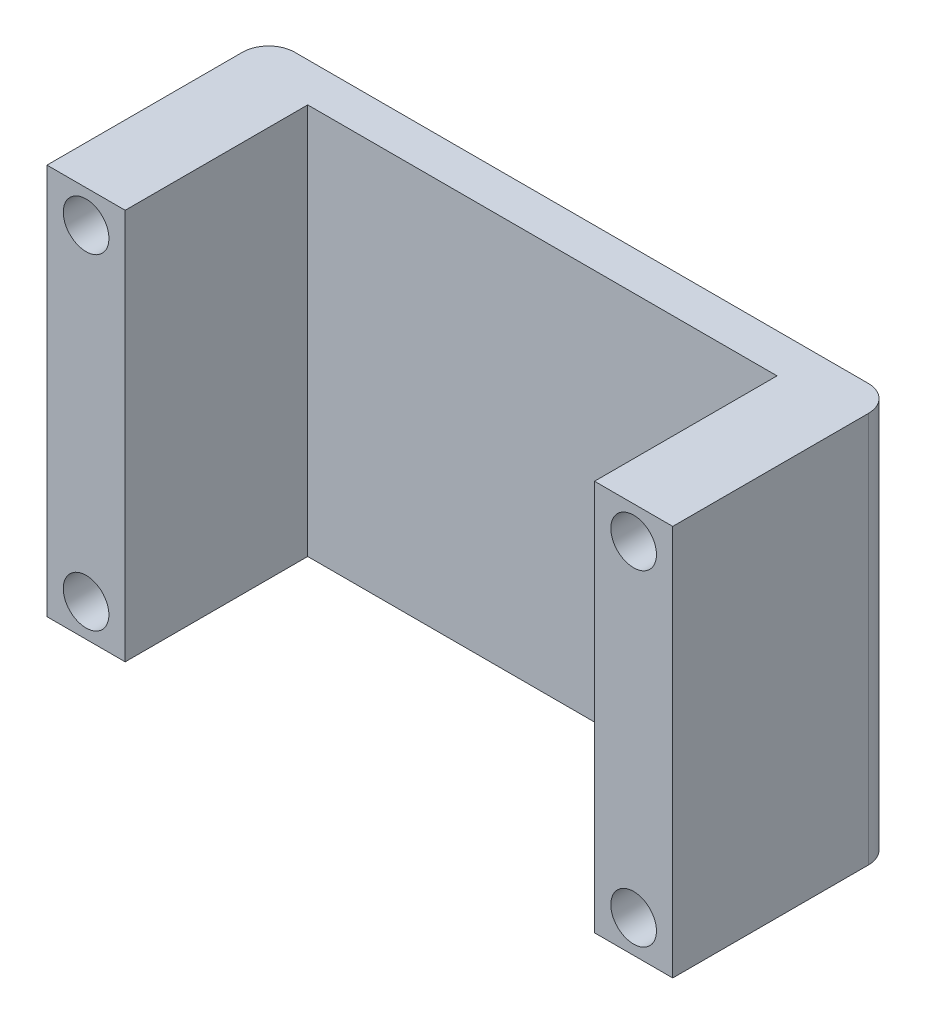
ISO-10303-21;
HEADER;
FILE_DESCRIPTION(('STEP AP214'),'2;1');
FILE_NAME('part.step','',(''),(''),'','','');
FILE_SCHEMA(('AUTOMOTIVE_DESIGN { 1 0 10303 214 1 1 1 1 }'));
ENDSEC;
DATA;
#1=APPLICATION_CONTEXT('core data for automotive mechanical design processes');
#2=APPLICATION_PROTOCOL_DEFINITION('international standard','automotive_design',2000,#1);
#3=PRODUCT_CONTEXT('',#1,'mechanical');
#4=PRODUCT('Part','Part','',(#3));
#5=PRODUCT_RELATED_PRODUCT_CATEGORY('part','',(#4));
#6=PRODUCT_DEFINITION_FORMATION('','',#4);
#7=PRODUCT_DEFINITION_CONTEXT('part definition',#1,'design');
#8=PRODUCT_DEFINITION('design','',#6,#7);
#9=PRODUCT_DEFINITION_SHAPE('','',#8);
#10=(LENGTH_UNIT() NAMED_UNIT(*) SI_UNIT(.MILLI.,.METRE.));
#11=(NAMED_UNIT(*) PLANE_ANGLE_UNIT() SI_UNIT($,.RADIAN.));
#12=(NAMED_UNIT(*) SI_UNIT($,.STERADIAN.) SOLID_ANGLE_UNIT());
#13=UNCERTAINTY_MEASURE_WITH_UNIT(LENGTH_MEASURE(1.E-05),#10,'distance_accuracy_value','');
#14=(GEOMETRIC_REPRESENTATION_CONTEXT(3) GLOBAL_UNCERTAINTY_ASSIGNED_CONTEXT((#13)) GLOBAL_UNIT_ASSIGNED_CONTEXT((#10,
#11,#12)) REPRESENTATION_CONTEXT('',''));
#15=CARTESIAN_POINT('',(0.,0.,0.));
#16=DIRECTION('',(0.,0.,1.));
#17=DIRECTION('',(1.,0.,0.));
#18=AXIS2_PLACEMENT_3D('',#15,#16,#17);
#19=CARTESIAN_POINT('',(0.,0.,3.));
#20=DIRECTION('',(0.,0.,1.));
#21=DIRECTION('',(1.,0.,0.));
#22=AXIS2_PLACEMENT_3D('',#19,#20,#21);
#23=PLANE('',#22);
#24=DIRECTION('',(-1.,0.,0.));
#25=VECTOR('',#24,1.);
#26=CARTESIAN_POINT('',(0.,-2.5,3.));
#27=LINE('',#26,#25);
#28=CARTESIAN_POINT('',(18.,-2.5,3.));
#29=VERTEX_POINT('',#28);
#30=CARTESIAN_POINT('',(-18.,-2.5,3.));
#31=VERTEX_POINT('',#30);
#32=EDGE_CURVE('E218',#29,#31,#27,.T.);
#33=ORIENTED_EDGE('',*,*,#32,.F.);
#34=DIRECTION('',(0.,-1.,0.));
#35=VECTOR('',#34,1.);
#36=CARTESIAN_POINT('',(18.,0.,3.));
#37=LINE('',#36,#35);
#38=CARTESIAN_POINT('',(18.,27.5,3.));
#39=VERTEX_POINT('',#38);
#40=EDGE_CURVE('E363',#39,#29,#37,.T.);
#41=ORIENTED_EDGE('',*,*,#40,.F.);
#42=DIRECTION('',(-1.,0.,0.));
#43=VECTOR('',#42,1.);
#44=CARTESIAN_POINT('',(0.,27.5,3.));
#45=LINE('',#44,#43);
#46=CARTESIAN_POINT('',(-18.,27.5,3.));
#47=VERTEX_POINT('',#46);
#48=EDGE_CURVE('E174',#39,#47,#45,.T.);
#49=ORIENTED_EDGE('',*,*,#48,.T.);
#50=DIRECTION('',(0.,-1.,0.));
#51=VECTOR('',#50,1.);
#52=CARTESIAN_POINT('',(-18.,0.,3.));
#53=LINE('',#52,#51);
#54=EDGE_CURVE('E176',#47,#31,#53,.T.);
#55=ORIENTED_EDGE('',*,*,#54,.T.);
#56=EDGE_LOOP('',(#33,#41,#49,#55));
#57=FACE_BOUND('',#56,.T.);
#58=ADVANCED_FACE('F40',(#57),#23,.T.);
#59=CARTESIAN_POINT('',(24.,0.,3.));
#60=DIRECTION('',(1.,0.,0.));
#61=DIRECTION('',(0.,0.,-1.));
#62=AXIS2_PLACEMENT_3D('',#59,#60,#61);
#63=PLANE('',#62);
#64=DIRECTION('',(0.,0.,-1.));
#65=VECTOR('',#64,1.);
#66=CARTESIAN_POINT('',(24.,-2.5,3.));
#67=LINE('',#66,#65);
#68=CARTESIAN_POINT('',(24.,-2.5,17.));
#69=VERTEX_POINT('',#68);
#70=CARTESIAN_POINT('',(24.,-2.5,2.));
#71=VERTEX_POINT('',#70);
#72=EDGE_CURVE('E222',#69,#71,#67,.T.);
#73=ORIENTED_EDGE('',*,*,#72,.T.);
#74=DIRECTION('',(0.,-1.,0.));
#75=VECTOR('',#74,1.);
#76=CARTESIAN_POINT('',(24.,27.5,2.));
#77=LINE('',#76,#75);
#78=CARTESIAN_POINT('',(24.,27.5,2.));
#79=VERTEX_POINT('',#78);
#80=EDGE_CURVE('E70',#71,#79,#77,.F.);
#81=ORIENTED_EDGE('',*,*,#80,.T.);
#82=DIRECTION('',(0.,0.,-1.));
#83=VECTOR('',#82,1.);
#84=CARTESIAN_POINT('',(24.,27.5,3.));
#85=LINE('',#84,#83);
#86=CARTESIAN_POINT('',(24.,27.5,17.));
#87=VERTEX_POINT('',#86);
#88=EDGE_CURVE('E253',#87,#79,#85,.T.);
#89=ORIENTED_EDGE('',*,*,#88,.F.);
#90=DIRECTION('',(0.,1.,0.));
#91=VECTOR('',#90,1.);
#92=CARTESIAN_POINT('',(24.,0.,17.));
#93=LINE('',#92,#91);
#94=EDGE_CURVE('E167',#69,#87,#93,.T.);
#95=ORIENTED_EDGE('',*,*,#94,.F.);
#96=EDGE_LOOP('',(#73,#81,#89,#95));
#97=FACE_BOUND('',#96,.T.);
#98=ADVANCED_FACE('F299',(#97),#63,.T.);
#99=CARTESIAN_POINT('',(0.,27.5,3.));
#100=DIRECTION('',(0.,-1.,0.));
#101=DIRECTION('',(0.,0.,-1.));
#102=AXIS2_PLACEMENT_3D('',#99,#100,#101);
#103=PLANE('',#102);
#104=ORIENTED_EDGE('',*,*,#88,.T.);
#105=CARTESIAN_POINT('',(22.,27.5,2.));
#106=DIRECTION('',(0.,-1.,0.));
#107=DIRECTION('',(0.,0.,-1.));
#108=AXIS2_PLACEMENT_3D('',#105,#106,#107);
#109=CIRCLE('',#108,2.);
#110=CARTESIAN_POINT('',(22.,27.5,0.));
#111=VERTEX_POINT('',#110);
#112=EDGE_CURVE('E335',#79,#111,#109,.F.);
#113=ORIENTED_EDGE('',*,*,#112,.T.);
#114=DIRECTION('',(-1.,0.,0.));
#115=VECTOR('',#114,1.);
#116=CARTESIAN_POINT('',(0.,27.5,0.));
#117=LINE('',#116,#115);
#118=CARTESIAN_POINT('',(-22.,27.5,0.));
#119=VERTEX_POINT('',#118);
#120=EDGE_CURVE('E226',#111,#119,#117,.T.);
#121=ORIENTED_EDGE('',*,*,#120,.T.);
#122=CARTESIAN_POINT('',(-22.,27.5,2.));
#123=DIRECTION('',(0.,-1.,0.));
#124=DIRECTION('',(0.,0.,-1.));
#125=AXIS2_PLACEMENT_3D('',#122,#123,#124);
#126=CIRCLE('',#125,2.);
#127=CARTESIAN_POINT('',(-24.,27.5,2.));
#128=VERTEX_POINT('',#127);
#129=EDGE_CURVE('E62',#119,#128,#126,.F.);
#130=ORIENTED_EDGE('',*,*,#129,.T.);
#131=DIRECTION('',(0.,0.,-1.));
#132=VECTOR('',#131,1.);
#133=CARTESIAN_POINT('',(-24.,27.5,3.));
#134=LINE('',#133,#132);
#135=CARTESIAN_POINT('',(-24.,27.5,17.));
#136=VERTEX_POINT('',#135);
#137=EDGE_CURVE('E250',#136,#128,#134,.T.);
#138=ORIENTED_EDGE('',*,*,#137,.F.);
#139=DIRECTION('',(-1.,0.,0.));
#140=VECTOR('',#139,1.);
#141=CARTESIAN_POINT('',(0.,27.5,17.));
#142=LINE('',#141,#140);
#143=CARTESIAN_POINT('',(-18.,27.5,17.));
#144=VERTEX_POINT('',#143);
#145=EDGE_CURVE('E189',#144,#136,#142,.T.);
#146=ORIENTED_EDGE('',*,*,#145,.F.);
#147=DIRECTION('',(0.,0.,-1.));
#148=VECTOR('',#147,1.);
#149=CARTESIAN_POINT('',(-18.,27.5,17.));
#150=LINE('',#149,#148);
#151=EDGE_CURVE('E212',#144,#47,#150,.T.);
#152=ORIENTED_EDGE('',*,*,#151,.T.);
#153=ORIENTED_EDGE('',*,*,#48,.F.);
#154=DIRECTION('',(0.,0.,-1.));
#155=VECTOR('',#154,1.);
#156=CARTESIAN_POINT('',(18.,27.5,17.));
#157=LINE('',#156,#155);
#158=CARTESIAN_POINT('',(18.,27.5,17.));
#159=VERTEX_POINT('',#158);
#160=EDGE_CURVE('E153',#159,#39,#157,.T.);
#161=ORIENTED_EDGE('',*,*,#160,.F.);
#162=DIRECTION('',(-1.,0.,0.));
#163=VECTOR('',#162,1.);
#164=CARTESIAN_POINT('',(0.,27.5,17.));
#165=LINE('',#164,#163);
#166=EDGE_CURVE('E161',#87,#159,#165,.T.);
#167=ORIENTED_EDGE('',*,*,#166,.F.);
#168=EDGE_LOOP('',(#104,#113,#121,#130,#138,#146,#152,#153,#161,#167));
#169=FACE_BOUND('',#168,.T.);
#170=ADVANCED_FACE('F172',(#169),#103,.F.);
#171=CARTESIAN_POINT('',(-24.,0.,3.));
#172=DIRECTION('',(1.,0.,0.));
#173=DIRECTION('',(0.,0.,-1.));
#174=AXIS2_PLACEMENT_3D('',#171,#172,#173);
#175=PLANE('',#174);
#176=ORIENTED_EDGE('',*,*,#137,.T.);
#177=DIRECTION('',(0.,-1.,0.));
#178=VECTOR('',#177,1.);
#179=CARTESIAN_POINT('',(-24.,0.,2.));
#180=LINE('',#179,#178);
#181=CARTESIAN_POINT('',(-24.,-2.5,2.));
#182=VERTEX_POINT('',#181);
#183=EDGE_CURVE('E331',#128,#182,#180,.T.);
#184=ORIENTED_EDGE('',*,*,#183,.T.);
#185=DIRECTION('',(0.,0.,-1.));
#186=VECTOR('',#185,1.);
#187=CARTESIAN_POINT('',(-24.,-2.5,3.));
#188=LINE('',#187,#186);
#189=CARTESIAN_POINT('',(-24.,-2.5,17.));
#190=VERTEX_POINT('',#189);
#191=EDGE_CURVE('E246',#190,#182,#188,.T.);
#192=ORIENTED_EDGE('',*,*,#191,.F.);
#193=DIRECTION('',(0.,-1.,0.));
#194=VECTOR('',#193,1.);
#195=CARTESIAN_POINT('',(-24.,0.,17.));
#196=LINE('',#195,#194);
#197=EDGE_CURVE('E193',#136,#190,#196,.T.);
#198=ORIENTED_EDGE('',*,*,#197,.F.);
#199=EDGE_LOOP('',(#176,#184,#192,#198));
#200=FACE_BOUND('',#199,.T.);
#201=ADVANCED_FACE('F304',(#200),#175,.F.);
#202=CARTESIAN_POINT('',(21.,0.,3.));
#203=DIRECTION('',(0.,0.,-1.));
#204=DIRECTION('',(-1.,0.,0.));
#205=AXIS2_PLACEMENT_3D('',#202,#203,#204);
#206=CYLINDRICAL_SURFACE('',#205,1.75);
#207=CARTESIAN_POINT('',(21.,0.,0.));
#208=DIRECTION('',(0.,0.,1.));
#209=DIRECTION('',(1.,0.,0.));
#210=AXIS2_PLACEMENT_3D('',#207,#208,#209);
#211=CIRCLE('',#210,1.75);
#212=CARTESIAN_POINT('',(22.,1.43614066163452,0.));
#213=VERTEX_POINT('',#212);
#214=CARTESIAN_POINT('',(22.,-1.4361406616345,0.));
#215=VERTEX_POINT('',#214);
#216=EDGE_CURVE('E237',#213,#215,#211,.T.);
#217=ORIENTED_EDGE('',*,*,#216,.F.);
#218=CARTESIAN_POINT('',(22.,1.43614066163452,0.));
#219=CARTESIAN_POINT('',(22.0394101312862,1.4087025534905,-1.653426172194E-06));
#220=CARTESIAN_POINT('',(22.0776529479483,1.37966066414263,0.0011648667819498));
#221=CARTESIAN_POINT('',(22.1515347730133,1.31862066085352,0.00540640669858472));
#222=CARTESIAN_POINT('',(22.1871760819335,1.28662521687753,0.00847971680610111));
#223=CARTESIAN_POINT('',(22.2896615806187,1.1867367336802,0.019896611775395));
#224=CARTESIAN_POINT('',(22.3523419674851,1.11474938211667,0.0304430569416723));
#225=CARTESIAN_POINT('',(22.4648668570801,0.962107474227694,0.053925487698336));
#226=CARTESIAN_POINT('',(22.5147444010081,0.88147600549363,0.0668551712863237));
#227=CARTESIAN_POINT('',(22.6009372453695,0.713054606439186,0.0918879422994472));
#228=CARTESIAN_POINT('',(22.6372437719213,0.625260089616672,0.1039904908516));
#229=CARTESIAN_POINT('',(22.6965952241665,0.440355149551904,0.124951714333855));
#230=CARTESIAN_POINT('',(22.718954574651,0.343002064091985,0.1336358988161));
#231=CARTESIAN_POINT('',(22.7467729705788,0.145600647265177,0.144584588560616));
#232=CARTESIAN_POINT('',(22.7522467923181,0.0455547497343221,0.146854706538693));
#233=CARTESIAN_POINT('',(22.7462812751461,-0.147260334287824,0.144450748645523));
#234=CARTESIAN_POINT('',(22.7359406055939,-0.240071681642156,0.140227663730597));
#235=CARTESIAN_POINT('',(22.7007620834566,-0.42255539078511,0.12669245846074));
#236=CARTESIAN_POINT('',(22.6759142462196,-0.512225545527238,0.117376833413613));
#237=CARTESIAN_POINT('',(22.612307976271,-0.686771992142668,0.0957400905825111));
#238=CARTESIAN_POINT('',(22.573455602562,-0.77161131866472,0.0833988605993058));
#239=CARTESIAN_POINT('',(22.4828431420257,-0.933978896971912,0.0585922000699776));
#240=CARTESIAN_POINT('',(22.4310928228151,-1.01151262033905,0.0461268703317022));
#241=CARTESIAN_POINT('',(22.3204726380544,-1.15157543862619,0.025110602843196));
#242=CARTESIAN_POINT('',(22.2625572279872,-1.21481672531508,0.0163198228051693));
#243=CARTESIAN_POINT('',(22.1689684574375,-1.30301973311573,0.00690261739822955));
#244=CARTESIAN_POINT('',(22.1366046783922,-1.33134463298544,0.00439087677978364));
#245=CARTESIAN_POINT('',(22.0698068350466,-1.38559265668725,0.000938387110218526));
#246=CARTESIAN_POINT('',(22.0353712546135,-1.41151398546604,-1.19659579731411E-06));
#247=CARTESIAN_POINT('',(22.,-1.4361406616345,0.));
#248=B_SPLINE_CURVE_WITH_KNOTS('',3,(#218,#219,#220,#221,#222,#223,#224,#225,#226,#227,#228,
#229,#230,#231,#232,#233,#234,#235,#236,#237,#238,#239,#240,#241,#242,#243,#244,#245,#246,#247),
.UNSPECIFIED.,.F.,.F.,(4,2,2,2,2,2,2,2,2,2,2,2,2,2,4),(0.,0.143936530303794,0.287744195259935,
0.574368080973,0.860244645337262,1.14630571513936,1.44550348268944,1.74443935197017,
2.02353013921659,2.3028132393179,2.58400571066732,2.86498587852568,3.12251922925723,
3.25163497266041,3.38084637944904),.UNSPECIFIED.);
#249=EDGE_CURVE('E283',#213,#215,#248,.T.);
#250=ORIENTED_EDGE('',*,*,#249,.T.);
#251=EDGE_LOOP('',(#217,#250));
#252=FACE_BOUND('',#251,.T.);
#253=CARTESIAN_POINT('',(21.,0.,17.));
#254=DIRECTION('',(0.,0.,1.));
#255=DIRECTION('',(1.,0.,0.));
#256=AXIS2_PLACEMENT_3D('',#253,#254,#255);
#257=CIRCLE('',#256,1.75);
#258=CARTESIAN_POINT('',(22.75,0.,17.));
#259=VERTEX_POINT('',#258);
#260=EDGE_CURVE('E169',#259,#259,#257,.F.);
#261=ORIENTED_EDGE('',*,*,#260,.F.);
#262=EDGE_LOOP('',(#261));
#263=FACE_BOUND('',#262,.T.);
#264=ADVANCED_FACE('F307',(#252,#263),#206,.F.);
#265=CARTESIAN_POINT('',(-21.,25.,3.));
#266=DIRECTION('',(0.,0.,-1.));
#267=DIRECTION('',(-1.,0.,0.));
#268=AXIS2_PLACEMENT_3D('',#265,#266,#267);
#269=CYLINDRICAL_SURFACE('',#268,1.75);
#270=CARTESIAN_POINT('',(-21.,25.,0.));
#271=DIRECTION('',(0.,0.,1.));
#272=DIRECTION('',(1.,0.,0.));
#273=AXIS2_PLACEMENT_3D('',#270,#271,#272);
#274=CIRCLE('',#273,1.75);
#275=CARTESIAN_POINT('',(-22.,26.4361406616345,0.));
#276=VERTEX_POINT('',#275);
#277=CARTESIAN_POINT('',(-22.,23.5638593383655,0.));
#278=VERTEX_POINT('',#277);
#279=EDGE_CURVE('E233',#276,#278,#274,.F.);
#280=ORIENTED_EDGE('',*,*,#279,.T.);
#281=CARTESIAN_POINT('',(-22.,23.5638593383655,0.));
#282=CARTESIAN_POINT('',(-22.0394101312862,23.5912974465095,-1.65342617208012E-06));
#283=CARTESIAN_POINT('',(-22.0776529479483,23.6203393358573,0.00116486678194982));
#284=CARTESIAN_POINT('',(-22.1515347730133,23.6813793391465,0.0054064066985845));
#285=CARTESIAN_POINT('',(-22.1871760819335,23.7133747831224,0.00847971680610069));
#286=CARTESIAN_POINT('',(-22.2896615806187,23.8132632663198,0.0198966117753947));
#287=CARTESIAN_POINT('',(-22.3523419674851,23.8852506178833,0.0304430569416732));
#288=CARTESIAN_POINT('',(-22.4648668570801,24.0378925257723,0.0539254876983376));
#289=CARTESIAN_POINT('',(-22.5147444010081,24.1185239945063,0.0668551712863249));
#290=CARTESIAN_POINT('',(-22.6009372453695,24.2869453935608,0.0918879422994486));
#291=CARTESIAN_POINT('',(-22.6372437719213,24.3747399103833,0.103990490851602));
#292=CARTESIAN_POINT('',(-22.6965952241665,24.5596448504481,0.124951714333858));
#293=CARTESIAN_POINT('',(-22.718954574651,24.656997935908,0.133635898816104));
#294=CARTESIAN_POINT('',(-22.7467729705788,24.8543993527348,0.144584588560621));
#295=CARTESIAN_POINT('',(-22.7522467923182,24.9544452502656,0.146854706538698));
#296=CARTESIAN_POINT('',(-22.7462812751461,25.1472603342878,0.14445074864553));
#297=CARTESIAN_POINT('',(-22.7359406055939,25.2400716816421,0.140227663730604));
#298=CARTESIAN_POINT('',(-22.7007620834567,25.4225553907851,0.126692458460748));
#299=CARTESIAN_POINT('',(-22.6759142462197,25.5122255455272,0.11737683341362));
#300=CARTESIAN_POINT('',(-22.612307976271,25.6867719921426,0.0957400905825187));
#301=CARTESIAN_POINT('',(-22.573455602562,25.7716113186647,0.0833988605993134));
#302=CARTESIAN_POINT('',(-22.4828431420257,25.9339788969719,0.0585922000699845));
#303=CARTESIAN_POINT('',(-22.4310928228151,26.011512620339,0.0461268703317083));
#304=CARTESIAN_POINT('',(-22.3204726380544,26.1515754386262,0.0251106028431998));
#305=CARTESIAN_POINT('',(-22.2625572279872,26.2148167253151,0.0163198228051718));
#306=CARTESIAN_POINT('',(-22.1689684574375,26.3030197331157,0.00690261739823057));
#307=CARTESIAN_POINT('',(-22.1366046783922,26.3313446329854,0.00439087677978423));
#308=CARTESIAN_POINT('',(-22.0698068350466,26.3855926566872,0.00093838711021861));
#309=CARTESIAN_POINT('',(-22.0353712546135,26.411513985466,-1.19659579730974E-06));
#310=CARTESIAN_POINT('',(-22.,26.4361406616345,0.));
#311=B_SPLINE_CURVE_WITH_KNOTS('',3,(#281,#282,#283,#284,#285,#286,#287,#288,#289,#290,#291,
#292,#293,#294,#295,#296,#297,#298,#299,#300,#301,#302,#303,#304,#305,#306,#307,#308,#309,#310),
.UNSPECIFIED.,.F.,.F.,(4,2,2,2,2,2,2,2,2,2,2,2,2,2,4),(0.,0.143936530303792,0.287744195259929,
0.574368080972999,0.860244645337264,1.14630571513936,1.44550348268943,1.74443935197017,
2.02353013921659,2.30281323931789,2.58400571066732,2.86498587852568,3.12251922925725,
3.25163497266044,3.38084637944908),.UNSPECIFIED.);
#312=EDGE_CURVE('E11',#278,#276,#311,.T.);
#313=ORIENTED_EDGE('',*,*,#312,.T.);
#314=EDGE_LOOP('',(#280,#313));
#315=FACE_BOUND('',#314,.T.);
#316=CARTESIAN_POINT('',(-21.,25.,17.));
#317=DIRECTION('',(0.,0.,1.));
#318=DIRECTION('',(1.,0.,0.));
#319=AXIS2_PLACEMENT_3D('',#316,#317,#318);
#320=CIRCLE('',#319,1.75);
#321=CARTESIAN_POINT('',(-19.25,25.,17.));
#322=VERTEX_POINT('',#321);
#323=EDGE_CURVE('E204',#322,#322,#320,.F.);
#324=ORIENTED_EDGE('',*,*,#323,.F.);
#325=EDGE_LOOP('',(#324));
#326=FACE_BOUND('',#325,.T.);
#327=ADVANCED_FACE('F310',(#315,#326),#269,.F.);
#328=CARTESIAN_POINT('',(0.,-2.5,3.));
#329=DIRECTION('',(0.,-1.,0.));
#330=DIRECTION('',(0.,0.,-1.));
#331=AXIS2_PLACEMENT_3D('',#328,#329,#330);
#332=PLANE('',#331);
#333=DIRECTION('',(-1.,0.,0.));
#334=VECTOR('',#333,1.);
#335=CARTESIAN_POINT('',(0.,-2.5,0.));
#336=LINE('',#335,#334);
#337=CARTESIAN_POINT('',(22.,-2.5,0.));
#338=VERTEX_POINT('',#337);
#339=CARTESIAN_POINT('',(-22.,-2.5,0.));
#340=VERTEX_POINT('',#339);
#341=EDGE_CURVE('E229',#338,#340,#336,.T.);
#342=ORIENTED_EDGE('',*,*,#341,.F.);
#343=CARTESIAN_POINT('',(22.,-2.5,2.));
#344=DIRECTION('',(0.,-1.,0.));
#345=DIRECTION('',(0.,0.,-1.));
#346=AXIS2_PLACEMENT_3D('',#343,#344,#345);
#347=CIRCLE('',#346,2.);
#348=EDGE_CURVE('E342',#338,#71,#347,.T.);
#349=ORIENTED_EDGE('',*,*,#348,.T.);
#350=ORIENTED_EDGE('',*,*,#72,.F.);
#351=DIRECTION('',(1.,0.,0.));
#352=VECTOR('',#351,1.);
#353=CARTESIAN_POINT('',(0.,-2.5,17.));
#354=LINE('',#353,#352);
#355=CARTESIAN_POINT('',(18.,-2.5,17.));
#356=VERTEX_POINT('',#355);
#357=EDGE_CURVE('E160',#356,#69,#354,.T.);
#358=ORIENTED_EDGE('',*,*,#357,.F.);
#359=DIRECTION('',(0.,0.,-1.));
#360=VECTOR('',#359,1.);
#361=CARTESIAN_POINT('',(18.,-2.5,17.));
#362=LINE('',#361,#360);
#363=EDGE_CURVE('E155',#356,#29,#362,.T.);
#364=ORIENTED_EDGE('',*,*,#363,.T.);
#365=ORIENTED_EDGE('',*,*,#32,.T.);
#366=DIRECTION('',(0.,0.,-1.));
#367=VECTOR('',#366,1.);
#368=CARTESIAN_POINT('',(-18.,-2.5,17.));
#369=LINE('',#368,#367);
#370=CARTESIAN_POINT('',(-18.,-2.5,17.));
#371=VERTEX_POINT('',#370);
#372=EDGE_CURVE('E207',#371,#31,#369,.T.);
#373=ORIENTED_EDGE('',*,*,#372,.F.);
#374=DIRECTION('',(1.,0.,0.));
#375=VECTOR('',#374,1.);
#376=CARTESIAN_POINT('',(0.,-2.5,17.));
#377=LINE('',#376,#375);
#378=EDGE_CURVE('E197',#190,#371,#377,.T.);
#379=ORIENTED_EDGE('',*,*,#378,.F.);
#380=ORIENTED_EDGE('',*,*,#191,.T.);
#381=CARTESIAN_POINT('',(-22.,-2.5,2.));
#382=DIRECTION('',(0.,-1.,0.));
#383=DIRECTION('',(0.,0.,-1.));
#384=AXIS2_PLACEMENT_3D('',#381,#382,#383);
#385=CIRCLE('',#384,2.);
#386=EDGE_CURVE('E344',#182,#340,#385,.T.);
#387=ORIENTED_EDGE('',*,*,#386,.T.);
#388=EDGE_LOOP('',(#342,#349,#350,#358,#364,#365,#373,#379,#380,#387));
#389=FACE_BOUND('',#388,.T.);
#390=ADVANCED_FACE('F297',(#389),#332,.T.);
#391=CARTESIAN_POINT('',(21.,25.,3.));
#392=DIRECTION('',(0.,0.,-1.));
#393=DIRECTION('',(-1.,0.,0.));
#394=AXIS2_PLACEMENT_3D('',#391,#392,#393);
#395=CYLINDRICAL_SURFACE('',#394,1.75);
#396=CARTESIAN_POINT('',(21.,25.,0.));
#397=DIRECTION('',(0.,0.,1.));
#398=DIRECTION('',(1.,0.,0.));
#399=AXIS2_PLACEMENT_3D('',#396,#397,#398);
#400=CIRCLE('',#399,1.75);
#401=CARTESIAN_POINT('',(22.,23.5638593383655,0.));
#402=VERTEX_POINT('',#401);
#403=CARTESIAN_POINT('',(22.,26.4361406616345,0.));
#404=VERTEX_POINT('',#403);
#405=EDGE_CURVE('E215',#402,#404,#400,.F.);
#406=ORIENTED_EDGE('',*,*,#405,.T.);
#407=CARTESIAN_POINT('',(22.,26.4361406616345,0.));
#408=CARTESIAN_POINT('',(22.0394101312862,26.4087025534905,-1.65342617186308E-06));
#409=CARTESIAN_POINT('',(22.0776529479483,26.3796606641426,0.00116486678195016));
#410=CARTESIAN_POINT('',(22.1515347730133,26.3186206608535,0.00540640669858488));
#411=CARTESIAN_POINT('',(22.1871760819335,26.2866252168775,0.00847971680610097));
#412=CARTESIAN_POINT('',(22.2896615806187,26.1867367336802,0.0198966117753946));
#413=CARTESIAN_POINT('',(22.3523419674851,26.1147493821167,0.0304430569416725));
#414=CARTESIAN_POINT('',(22.4648668570801,25.9621074742277,0.0539254876983367));
#415=CARTESIAN_POINT('',(22.5147444010081,25.8814760054936,0.0668551712863243));
#416=CARTESIAN_POINT('',(22.6009372453695,25.7130546064392,0.0918879422994476));
#417=CARTESIAN_POINT('',(22.6372437719213,25.6252600896167,0.1039904908516));
#418=CARTESIAN_POINT('',(22.6965952241665,25.4403551495519,0.124951714333855));
#419=CARTESIAN_POINT('',(22.718954574651,25.343002064092,0.1336358988161));
#420=CARTESIAN_POINT('',(22.7467729705788,25.1456006472652,0.144584588560616));
#421=CARTESIAN_POINT('',(22.7522467923181,25.0455547497343,0.146854706538693));
#422=CARTESIAN_POINT('',(22.7462812751461,24.8527396657122,0.144450748645523));
#423=CARTESIAN_POINT('',(22.7359406055939,24.7599283183578,0.140227663730597));
#424=CARTESIAN_POINT('',(22.7007620834566,24.5774446092149,0.12669245846074));
#425=CARTESIAN_POINT('',(22.6759142462196,24.4877744544727,0.117376833413612));
#426=CARTESIAN_POINT('',(22.612307976271,24.3132280078573,0.0957400905825109));
#427=CARTESIAN_POINT('',(22.573455602562,24.2283886813353,0.0833988605993061));
#428=CARTESIAN_POINT('',(22.4828431420257,24.0660211030281,0.0585922000699781));
#429=CARTESIAN_POINT('',(22.4310928228151,23.9884873796609,0.0461268703317023));
#430=CARTESIAN_POINT('',(22.3204726380544,23.8484245613738,0.0251106028431961));
#431=CARTESIAN_POINT('',(22.2625572279872,23.7851832746849,0.0163198228051697));
#432=CARTESIAN_POINT('',(22.1689684574375,23.6969802668843,0.00690261739822976));
#433=CARTESIAN_POINT('',(22.1366046783922,23.6686553670145,0.00439087677978368));
#434=CARTESIAN_POINT('',(22.0698068350466,23.6144073433127,0.000938387110218506));
#435=CARTESIAN_POINT('',(22.0353712546135,23.5884860145339,-1.19659579725696E-06));
#436=CARTESIAN_POINT('',(22.,23.5638593383655,0.));
#437=B_SPLINE_CURVE_WITH_KNOTS('',3,(#407,#408,#409,#410,#411,#412,#413,#414,#415,#416,#417,
#418,#419,#420,#421,#422,#423,#424,#425,#426,#427,#428,#429,#430,#431,#432,#433,#434,#435,#436),
.UNSPECIFIED.,.F.,.F.,(4,2,2,2,2,2,2,2,2,2,2,2,2,2,4),(0.,0.143936530303794,0.287744195259931,
0.574368080973004,0.86024464533727,1.14630571513937,1.44550348268944,1.74443935197018,
2.0235301392166,2.3028132393179,2.58400571066733,2.86498587852568,3.12251922925723,
3.25163497266041,3.38084637944904),.UNSPECIFIED.);
#438=EDGE_CURVE('E275',#404,#402,#437,.T.);
#439=ORIENTED_EDGE('',*,*,#438,.T.);
#440=EDGE_LOOP('',(#406,#439));
#441=FACE_BOUND('',#440,.T.);
#442=CARTESIAN_POINT('',(21.,25.,17.));
#443=DIRECTION('',(0.,0.,1.));
#444=DIRECTION('',(1.,0.,0.));
#445=AXIS2_PLACEMENT_3D('',#442,#443,#444);
#446=CIRCLE('',#445,1.75);
#447=CARTESIAN_POINT('',(22.75,25.,17.));
#448=VERTEX_POINT('',#447);
#449=EDGE_CURVE('E365',#448,#448,#446,.F.);
#450=ORIENTED_EDGE('',*,*,#449,.F.);
#451=EDGE_LOOP('',(#450));
#452=FACE_BOUND('',#451,.T.);
#453=ADVANCED_FACE('F292',(#441,#452),#395,.F.);
#454=CARTESIAN_POINT('',(-21.,0.,3.));
#455=DIRECTION('',(0.,0.,-1.));
#456=DIRECTION('',(-1.,0.,0.));
#457=AXIS2_PLACEMENT_3D('',#454,#455,#456);
#458=CYLINDRICAL_SURFACE('',#457,1.75);
#459=CARTESIAN_POINT('',(-21.,0.,0.));
#460=DIRECTION('',(0.,0.,1.));
#461=DIRECTION('',(1.,0.,0.));
#462=AXIS2_PLACEMENT_3D('',#459,#460,#461);
#463=CIRCLE('',#462,1.75);
#464=CARTESIAN_POINT('',(-22.,-1.43614066163451,0.));
#465=VERTEX_POINT('',#464);
#466=CARTESIAN_POINT('',(-22.,1.4361406616345,0.));
#467=VERTEX_POINT('',#466);
#468=EDGE_CURVE('E219',#465,#467,#463,.T.);
#469=ORIENTED_EDGE('',*,*,#468,.F.);
#470=CARTESIAN_POINT('',(-22.,-1.43614066163451,0.));
#471=CARTESIAN_POINT('',(-22.0394101312862,-1.4087025534905,-1.65342617218135E-06));
#472=CARTESIAN_POINT('',(-22.0776529479483,-1.37966066414263,0.00116486678194981));
#473=CARTESIAN_POINT('',(-22.1515347730133,-1.31862066085351,0.00540640669858473));
#474=CARTESIAN_POINT('',(-22.1871760819335,-1.28662521687753,0.00847971680610111));
#475=CARTESIAN_POINT('',(-22.2896615806187,-1.1867367336802,0.019896611775395));
#476=CARTESIAN_POINT('',(-22.3523419674851,-1.11474938211666,0.0304430569416723));
#477=CARTESIAN_POINT('',(-22.4648668570801,-0.962107474227692,0.053925487698336));
#478=CARTESIAN_POINT('',(-22.5147444010081,-0.881476005493627,0.0668551712863237));
#479=CARTESIAN_POINT('',(-22.6009372453695,-0.713054606439184,0.0918879422994473));
#480=CARTESIAN_POINT('',(-22.6372437719213,-0.625260089616669,0.1039904908516));
#481=CARTESIAN_POINT('',(-22.6965952241665,-0.440355149551902,0.124951714333855));
#482=CARTESIAN_POINT('',(-22.718954574651,-0.343002064091984,0.1336358988161));
#483=CARTESIAN_POINT('',(-22.7467729705788,-0.145600647265176,0.144584588560616));
#484=CARTESIAN_POINT('',(-22.7522467923181,-0.0455547497343201,0.146854706538693));
#485=CARTESIAN_POINT('',(-22.7462812751461,0.147260334287826,0.144450748645523));
#486=CARTESIAN_POINT('',(-22.7359406055939,0.240071681642157,0.140227663730597));
#487=CARTESIAN_POINT('',(-22.7007620834566,0.422555390785111,0.12669245846074));
#488=CARTESIAN_POINT('',(-22.6759142462196,0.51222554552724,0.117376833413613));
#489=CARTESIAN_POINT('',(-22.612307976271,0.68677199214267,0.0957400905825114));
#490=CARTESIAN_POINT('',(-22.573455602562,0.771611318664722,0.0833988605993063));
#491=CARTESIAN_POINT('',(-22.4828431420257,0.933978896971913,0.0585922000699781));
#492=CARTESIAN_POINT('',(-22.4310928228151,1.01151262033905,0.0461268703317024));
#493=CARTESIAN_POINT('',(-22.3204726380544,1.15157543862619,0.0251106028431959));
#494=CARTESIAN_POINT('',(-22.2625572279872,1.21481672531508,0.0163198228051693));
#495=CARTESIAN_POINT('',(-22.1689684574375,1.30301973311573,0.0069026173982296));
#496=CARTESIAN_POINT('',(-22.1366046783922,1.33134463298544,0.00439087677978371));
#497=CARTESIAN_POINT('',(-22.0698068350466,1.38559265668725,0.000938387110218609));
#498=CARTESIAN_POINT('',(-22.0353712546135,1.41151398546604,-1.19659579724201E-06));
#499=CARTESIAN_POINT('',(-22.,1.4361406616345,0.));
#500=B_SPLINE_CURVE_WITH_KNOTS('',3,(#470,#471,#472,#473,#474,#475,#476,#477,#478,#479,#480,
#481,#482,#483,#484,#485,#486,#487,#488,#489,#490,#491,#492,#493,#494,#495,#496,#497,#498,#499),
.UNSPECIFIED.,.F.,.F.,(4,2,2,2,2,2,2,2,2,2,2,2,2,2,4),(0.,0.143936530303794,0.287744195259935,
0.574368080973,0.860244645337262,1.14630571513936,1.44550348268943,1.74443935197017,
2.02353013921659,2.3028132393179,2.58400571066732,2.86498587852568,3.12251922925723,
3.25163497266041,3.38084637944904),.UNSPECIFIED.);
#501=EDGE_CURVE('E55',#465,#467,#500,.T.);
#502=ORIENTED_EDGE('',*,*,#501,.T.);
#503=EDGE_LOOP('',(#469,#502));
#504=FACE_BOUND('',#503,.T.);
#505=CARTESIAN_POINT('',(-21.,0.,17.));
#506=DIRECTION('',(0.,0.,1.));
#507=DIRECTION('',(1.,0.,0.));
#508=AXIS2_PLACEMENT_3D('',#505,#506,#507);
#509=CIRCLE('',#508,1.75);
#510=CARTESIAN_POINT('',(-19.25,0.,17.));
#511=VERTEX_POINT('',#510);
#512=EDGE_CURVE('E200',#511,#511,#509,.F.);
#513=ORIENTED_EDGE('',*,*,#512,.F.);
#514=EDGE_LOOP('',(#513));
#515=FACE_BOUND('',#514,.T.);
#516=ADVANCED_FACE('F296',(#504,#515),#458,.F.);
#517=CARTESIAN_POINT('',(0.,0.,0.));
#518=DIRECTION('',(0.,0.,1.));
#519=DIRECTION('',(1.,0.,0.));
#520=AXIS2_PLACEMENT_3D('',#517,#518,#519);
#521=PLANE('',#520);
#522=ORIENTED_EDGE('',*,*,#120,.F.);
#523=DIRECTION('',(0.,-1.,0.));
#524=VECTOR('',#523,1.);
#525=CARTESIAN_POINT('',(22.,-2.5,0.));
#526=LINE('',#525,#524);
#527=EDGE_CURVE('E271',#111,#404,#526,.T.);
#528=ORIENTED_EDGE('',*,*,#527,.T.);
#529=ORIENTED_EDGE('',*,*,#405,.F.);
#530=DIRECTION('',(0.,-1.,0.));
#531=VECTOR('',#530,1.);
#532=CARTESIAN_POINT('',(22.,-2.5,0.));
#533=LINE('',#532,#531);
#534=EDGE_CURVE('E268',#402,#213,#533,.T.);
#535=ORIENTED_EDGE('',*,*,#534,.T.);
#536=ORIENTED_EDGE('',*,*,#216,.T.);
#537=DIRECTION('',(0.,-1.,0.));
#538=VECTOR('',#537,1.);
#539=CARTESIAN_POINT('',(22.,-2.5,0.));
#540=LINE('',#539,#538);
#541=EDGE_CURVE('E265',#215,#338,#540,.T.);
#542=ORIENTED_EDGE('',*,*,#541,.T.);
#543=ORIENTED_EDGE('',*,*,#341,.T.);
#544=DIRECTION('',(0.,-1.,0.));
#545=VECTOR('',#544,1.);
#546=CARTESIAN_POINT('',(-22.,0.,0.));
#547=LINE('',#546,#545);
#548=EDGE_CURVE('E262',#340,#465,#547,.F.);
#549=ORIENTED_EDGE('',*,*,#548,.T.);
#550=ORIENTED_EDGE('',*,*,#468,.T.);
#551=DIRECTION('',(0.,-1.,0.));
#552=VECTOR('',#551,1.);
#553=CARTESIAN_POINT('',(-22.,0.,0.));
#554=LINE('',#553,#552);
#555=EDGE_CURVE('E259',#467,#278,#554,.F.);
#556=ORIENTED_EDGE('',*,*,#555,.T.);
#557=ORIENTED_EDGE('',*,*,#279,.F.);
#558=DIRECTION('',(0.,-1.,0.));
#559=VECTOR('',#558,1.);
#560=CARTESIAN_POINT('',(-22.,0.,0.));
#561=LINE('',#560,#559);
#562=EDGE_CURVE('E256',#276,#119,#561,.F.);
#563=ORIENTED_EDGE('',*,*,#562,.T.);
#564=EDGE_LOOP('',(#522,#528,#529,#535,#536,#542,#543,#549,#550,#556,#557,#563));
#565=FACE_BOUND('',#564,.T.);
#566=ADVANCED_FACE('F322',(#565),#521,.F.);
#567=CARTESIAN_POINT('',(-18.,0.,17.));
#568=DIRECTION('',(1.,0.,0.));
#569=DIRECTION('',(0.,1.,0.));
#570=AXIS2_PLACEMENT_3D('',#567,#568,#569);
#571=PLANE('',#570);
#572=ORIENTED_EDGE('',*,*,#54,.F.);
#573=ORIENTED_EDGE('',*,*,#151,.F.);
#574=DIRECTION('',(0.,-1.,0.));
#575=VECTOR('',#574,1.);
#576=CARTESIAN_POINT('',(-18.,0.,17.));
#577=LINE('',#576,#575);
#578=EDGE_CURVE('E181',#144,#371,#577,.T.);
#579=ORIENTED_EDGE('',*,*,#578,.T.);
#580=ORIENTED_EDGE('',*,*,#372,.T.);
#581=EDGE_LOOP('',(#572,#573,#579,#580));
#582=FACE_BOUND('',#581,.T.);
#583=ADVANCED_FACE('F391',(#582),#571,.T.);
#584=CARTESIAN_POINT('',(0.,0.,17.));
#585=DIRECTION('',(0.,0.,1.));
#586=DIRECTION('',(1.,0.,0.));
#587=AXIS2_PLACEMENT_3D('',#584,#585,#586);
#588=PLANE('',#587);
#589=ORIENTED_EDGE('',*,*,#578,.F.);
#590=ORIENTED_EDGE('',*,*,#145,.T.);
#591=ORIENTED_EDGE('',*,*,#197,.T.);
#592=ORIENTED_EDGE('',*,*,#378,.T.);
#593=EDGE_LOOP('',(#589,#590,#591,#592));
#594=FACE_BOUND('',#593,.T.);
#595=ORIENTED_EDGE('',*,*,#512,.T.);
#596=EDGE_LOOP('',(#595));
#597=FACE_BOUND('',#596,.T.);
#598=ORIENTED_EDGE('',*,*,#323,.T.);
#599=EDGE_LOOP('',(#598));
#600=FACE_BOUND('',#599,.T.);
#601=ADVANCED_FACE('F383',(#594,#597,#600),#588,.T.);
#602=CARTESIAN_POINT('',(18.,0.,17.));
#603=DIRECTION('',(1.,0.,0.));
#604=DIRECTION('',(0.,1.,0.));
#605=AXIS2_PLACEMENT_3D('',#602,#603,#604);
#606=PLANE('',#605);
#607=ORIENTED_EDGE('',*,*,#40,.T.);
#608=ORIENTED_EDGE('',*,*,#363,.F.);
#609=DIRECTION('',(0.,-1.,0.));
#610=VECTOR('',#609,1.);
#611=CARTESIAN_POINT('',(18.,0.,17.));
#612=LINE('',#611,#610);
#613=EDGE_CURVE('E148',#159,#356,#612,.T.);
#614=ORIENTED_EDGE('',*,*,#613,.F.);
#615=ORIENTED_EDGE('',*,*,#160,.T.);
#616=EDGE_LOOP('',(#607,#608,#614,#615));
#617=FACE_BOUND('',#616,.T.);
#618=ADVANCED_FACE('F151',(#617),#606,.F.);
#619=CARTESIAN_POINT('',(0.,0.,17.));
#620=DIRECTION('',(0.,0.,1.));
#621=DIRECTION('',(1.,0.,0.));
#622=AXIS2_PLACEMENT_3D('',#619,#620,#621);
#623=PLANE('',#622);
#624=ORIENTED_EDGE('',*,*,#449,.T.);
#625=EDGE_LOOP('',(#624));
#626=FACE_BOUND('',#625,.T.);
#627=ORIENTED_EDGE('',*,*,#260,.T.);
#628=EDGE_LOOP('',(#627));
#629=FACE_BOUND('',#628,.T.);
#630=ORIENTED_EDGE('',*,*,#166,.T.);
#631=ORIENTED_EDGE('',*,*,#613,.T.);
#632=ORIENTED_EDGE('',*,*,#357,.T.);
#633=ORIENTED_EDGE('',*,*,#94,.T.);
#634=EDGE_LOOP('',(#630,#631,#632,#633));
#635=FACE_BOUND('',#634,.T.);
#636=ADVANCED_FACE('F165',(#626,#629,#635),#623,.T.);
#637=CARTESIAN_POINT('',(22.,0.,2.));
#638=DIRECTION('',(0.,1.,0.));
#639=DIRECTION('',(0.,0.,1.));
#640=AXIS2_PLACEMENT_3D('',#637,#638,#639);
#641=CYLINDRICAL_SURFACE('',#640,2.);
#642=ORIENTED_EDGE('',*,*,#112,.F.);
#643=ORIENTED_EDGE('',*,*,#80,.F.);
#644=ORIENTED_EDGE('',*,*,#348,.F.);
#645=ORIENTED_EDGE('',*,*,#541,.F.);
#646=ORIENTED_EDGE('',*,*,#249,.F.);
#647=ORIENTED_EDGE('',*,*,#534,.F.);
#648=ORIENTED_EDGE('',*,*,#438,.F.);
#649=ORIENTED_EDGE('',*,*,#527,.F.);
#650=EDGE_LOOP('',(#642,#643,#644,#645,#646,#647,#648,#649));
#651=FACE_BOUND('',#650,.T.);
#652=ADVANCED_FACE('F290',(#651),#641,.T.);
#653=CARTESIAN_POINT('',(-22.,0.,2.));
#654=DIRECTION('',(0.,-1.,0.));
#655=DIRECTION('',(0.,0.,-1.));
#656=AXIS2_PLACEMENT_3D('',#653,#654,#655);
#657=CYLINDRICAL_SURFACE('',#656,2.);
#658=ORIENTED_EDGE('',*,*,#501,.F.);
#659=ORIENTED_EDGE('',*,*,#548,.F.);
#660=ORIENTED_EDGE('',*,*,#386,.F.);
#661=ORIENTED_EDGE('',*,*,#183,.F.);
#662=ORIENTED_EDGE('',*,*,#129,.F.);
#663=ORIENTED_EDGE('',*,*,#562,.F.);
#664=ORIENTED_EDGE('',*,*,#312,.F.);
#665=ORIENTED_EDGE('',*,*,#555,.F.);
#666=EDGE_LOOP('',(#658,#659,#660,#661,#662,#663,#664,#665));
#667=FACE_BOUND('',#666,.T.);
#668=ADVANCED_FACE('F42',(#667),#657,.T.);
#669=CLOSED_SHELL('',(#58,#98,#170,#201,#264,#327,#390,#453,#516,#566,#583,#601,#618,#636,#652,#668));
#670=MANIFOLD_SOLID_BREP('B2',#669);
#671=ADVANCED_BREP_SHAPE_REPRESENTATION('',(#18,#670),#14);
#672=SHAPE_DEFINITION_REPRESENTATION(#9,#671);
ENDSEC;
END-ISO-10303-21;
